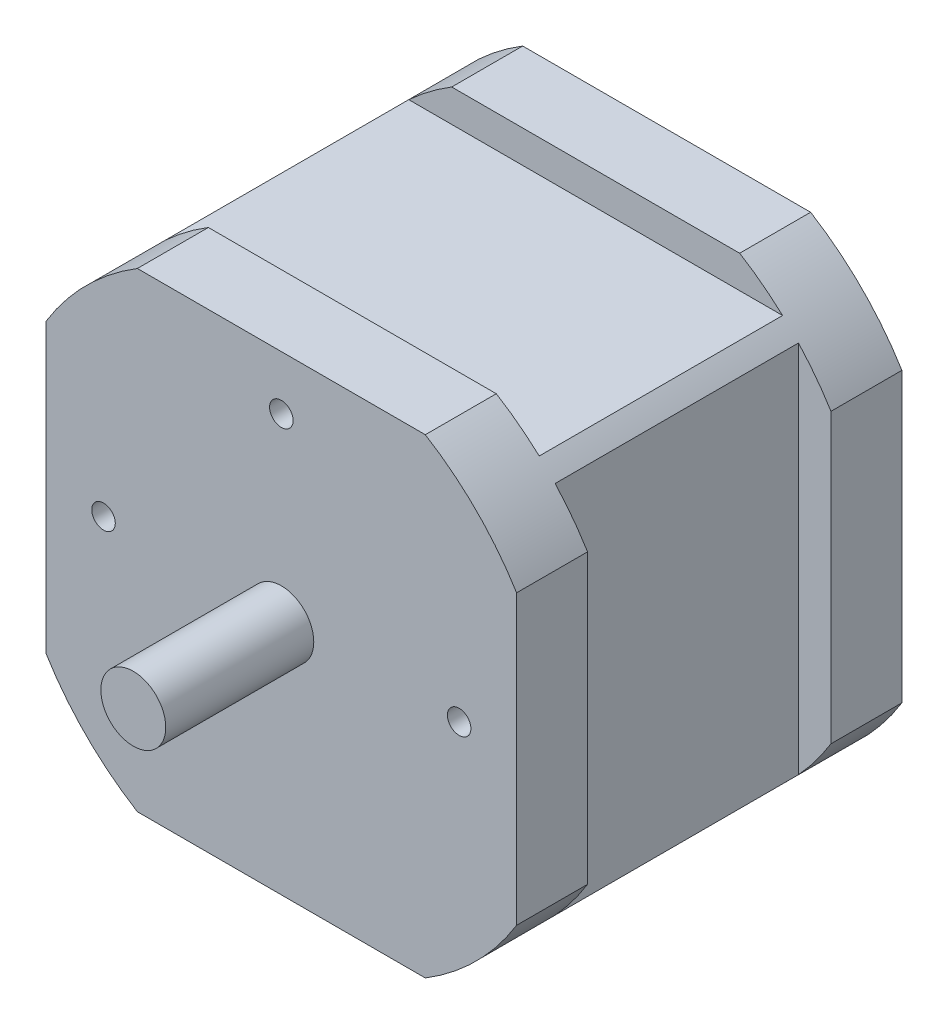
ISO-10303-21;
HEADER;
FILE_DESCRIPTION(('STEP AP214'),'2;1');
FILE_NAME('part.step','',(''),(''),'','','');
FILE_SCHEMA(('AUTOMOTIVE_DESIGN { 1 0 10303 214 1 1 1 1 }'));
ENDSEC;
DATA;
#1=APPLICATION_CONTEXT('core data for automotive mechanical design processes');
#2=APPLICATION_PROTOCOL_DEFINITION('international standard','automotive_design',2000,#1);
#3=PRODUCT_CONTEXT('',#1,'mechanical');
#4=PRODUCT('Part','Part','',(#3));
#5=PRODUCT_RELATED_PRODUCT_CATEGORY('part','',(#4));
#6=PRODUCT_DEFINITION_FORMATION('','',#4);
#7=PRODUCT_DEFINITION_CONTEXT('part definition',#1,'design');
#8=PRODUCT_DEFINITION('design','',#6,#7);
#9=PRODUCT_DEFINITION_SHAPE('','',#8);
#10=(LENGTH_UNIT() NAMED_UNIT(*) SI_UNIT(.MILLI.,.METRE.));
#11=(NAMED_UNIT(*) PLANE_ANGLE_UNIT() SI_UNIT($,.RADIAN.));
#12=(NAMED_UNIT(*) SI_UNIT($,.STERADIAN.) SOLID_ANGLE_UNIT());
#13=UNCERTAINTY_MEASURE_WITH_UNIT(LENGTH_MEASURE(1.E-05),#10,'distance_accuracy_value','');
#14=(GEOMETRIC_REPRESENTATION_CONTEXT(3) GLOBAL_UNCERTAINTY_ASSIGNED_CONTEXT((#13)) GLOBAL_UNIT_ASSIGNED_CONTEXT((#10,
#11,#12)) REPRESENTATION_CONTEXT('',''));
#15=CARTESIAN_POINT('',(0.,0.,0.));
#16=DIRECTION('',(0.,0.,1.));
#17=DIRECTION('',(1.,0.,0.));
#18=AXIS2_PLACEMENT_3D('',#15,#16,#17);
#19=CARTESIAN_POINT('',(25.,25.,30.));
#20=DIRECTION('',(-1.,0.,0.));
#21=DIRECTION('',(0.,-1.,0.));
#22=AXIS2_PLACEMENT_3D('',#19,#20,#21);
#23=PLANE('',#22);
#24=DIRECTION('',(0.,0.,1.));
#25=VECTOR('',#24,1.);
#26=CARTESIAN_POINT('',(25.,-23.0434372436058,-8.75));
#27=LINE('',#26,#25);
#28=CARTESIAN_POINT('',(25.,-23.0434372436058,0.));
#29=VERTEX_POINT('',#28);
#30=CARTESIAN_POINT('',(25.,-23.0434372436058,30.));
#31=VERTEX_POINT('',#30);
#32=EDGE_CURVE('E287',#29,#31,#27,.T.);
#33=ORIENTED_EDGE('',*,*,#32,.F.);
#34=DIRECTION('',(0.,1.,0.));
#35=VECTOR('',#34,1.);
#36=CARTESIAN_POINT('',(25.,25.,0.));
#37=LINE('',#36,#35);
#38=CARTESIAN_POINT('',(25.,23.0434372436058,0.));
#39=VERTEX_POINT('',#38);
#40=EDGE_CURVE('E362',#29,#39,#37,.T.);
#41=ORIENTED_EDGE('',*,*,#40,.T.);
#42=DIRECTION('',(0.,0.,1.));
#43=VECTOR('',#42,1.);
#44=CARTESIAN_POINT('',(25.,23.0434372436058,-8.75));
#45=LINE('',#44,#43);
#46=CARTESIAN_POINT('',(25.,23.0434372436058,30.));
#47=VERTEX_POINT('',#46);
#48=EDGE_CURVE('E294',#47,#39,#45,.F.);
#49=ORIENTED_EDGE('',*,*,#48,.F.);
#50=DIRECTION('',(0.,1.,0.));
#51=VECTOR('',#50,1.);
#52=CARTESIAN_POINT('',(25.,25.,30.));
#53=LINE('',#52,#51);
#54=EDGE_CURVE('E373',#31,#47,#53,.T.);
#55=ORIENTED_EDGE('',*,*,#54,.F.);
#56=EDGE_LOOP('',(#33,#41,#49,#55));
#57=FACE_BOUND('',#56,.T.);
#58=ADVANCED_FACE('F60',(#57),#23,.F.);
#59=CARTESIAN_POINT('',(-25.,25.,30.));
#60=DIRECTION('',(0.,-1.,0.));
#61=DIRECTION('',(0.,0.,-1.));
#62=AXIS2_PLACEMENT_3D('',#59,#60,#61);
#63=PLANE('',#62);
#64=DIRECTION('',(0.,0.,1.));
#65=VECTOR('',#64,1.);
#66=CARTESIAN_POINT('',(23.0434372436058,25.,-8.75));
#67=LINE('',#66,#65);
#68=CARTESIAN_POINT('',(23.0434372436058,25.,0.));
#69=VERTEX_POINT('',#68);
#70=CARTESIAN_POINT('',(23.0434372436058,25.,30.));
#71=VERTEX_POINT('',#70);
#72=EDGE_CURVE('E301',#69,#71,#67,.T.);
#73=ORIENTED_EDGE('',*,*,#72,.F.);
#74=DIRECTION('',(-1.,0.,0.));
#75=VECTOR('',#74,1.);
#76=CARTESIAN_POINT('',(-25.,25.,0.));
#77=LINE('',#76,#75);
#78=CARTESIAN_POINT('',(-23.0434372436058,25.,0.));
#79=VERTEX_POINT('',#78);
#80=EDGE_CURVE('E388',#69,#79,#77,.T.);
#81=ORIENTED_EDGE('',*,*,#80,.T.);
#82=DIRECTION('',(0.,0.,1.));
#83=VECTOR('',#82,1.);
#84=CARTESIAN_POINT('',(-23.0434372436058,25.,-8.75));
#85=LINE('',#84,#83);
#86=CARTESIAN_POINT('',(-23.0434372436058,25.,30.));
#87=VERTEX_POINT('',#86);
#88=EDGE_CURVE('E75',#87,#79,#85,.F.);
#89=ORIENTED_EDGE('',*,*,#88,.F.);
#90=DIRECTION('',(-1.,0.,0.));
#91=VECTOR('',#90,1.);
#92=CARTESIAN_POINT('',(-25.,25.,30.));
#93=LINE('',#92,#91);
#94=EDGE_CURVE('E376',#71,#87,#93,.T.);
#95=ORIENTED_EDGE('',*,*,#94,.F.);
#96=EDGE_LOOP('',(#73,#81,#89,#95));
#97=FACE_BOUND('',#96,.T.);
#98=ADVANCED_FACE('F470',(#97),#63,.F.);
#99=CARTESIAN_POINT('',(-25.,25.,30.));
#100=DIRECTION('',(1.,0.,0.));
#101=DIRECTION('',(0.,1.,0.));
#102=AXIS2_PLACEMENT_3D('',#99,#100,#101);
#103=PLANE('',#102);
#104=DIRECTION('',(0.,0.,1.));
#105=VECTOR('',#104,1.);
#106=CARTESIAN_POINT('',(-25.,23.0434372436058,-8.75));
#107=LINE('',#106,#105);
#108=CARTESIAN_POINT('',(-25.,23.0434372436058,0.));
#109=VERTEX_POINT('',#108);
#110=CARTESIAN_POINT('',(-25.,23.0434372436058,30.));
#111=VERTEX_POINT('',#110);
#112=EDGE_CURVE('E314',#109,#111,#107,.T.);
#113=ORIENTED_EDGE('',*,*,#112,.F.);
#114=DIRECTION('',(0.,-1.,0.));
#115=VECTOR('',#114,1.);
#116=CARTESIAN_POINT('',(-25.,25.,0.));
#117=LINE('',#116,#115);
#118=CARTESIAN_POINT('',(-25.,-23.0434372436058,0.));
#119=VERTEX_POINT('',#118);
#120=EDGE_CURVE('E391',#109,#119,#117,.T.);
#121=ORIENTED_EDGE('',*,*,#120,.T.);
#122=DIRECTION('',(0.,0.,1.));
#123=VECTOR('',#122,1.);
#124=CARTESIAN_POINT('',(-25.,-23.0434372436058,-8.75));
#125=LINE('',#124,#123);
#126=CARTESIAN_POINT('',(-25.,-23.0434372436058,30.));
#127=VERTEX_POINT('',#126);
#128=EDGE_CURVE('E83',#127,#119,#125,.F.);
#129=ORIENTED_EDGE('',*,*,#128,.F.);
#130=DIRECTION('',(0.,-1.,0.));
#131=VECTOR('',#130,1.);
#132=CARTESIAN_POINT('',(-25.,25.,30.));
#133=LINE('',#132,#131);
#134=EDGE_CURVE('E380',#111,#127,#133,.T.);
#135=ORIENTED_EDGE('',*,*,#134,.F.);
#136=EDGE_LOOP('',(#113,#121,#129,#135));
#137=FACE_BOUND('',#136,.T.);
#138=ADVANCED_FACE('F428',(#137),#103,.F.);
#139=CARTESIAN_POINT('',(-25.,-25.,30.));
#140=DIRECTION('',(0.,1.,0.));
#141=DIRECTION('',(0.,0.,1.));
#142=AXIS2_PLACEMENT_3D('',#139,#140,#141);
#143=PLANE('',#142);
#144=DIRECTION('',(0.,0.,1.));
#145=VECTOR('',#144,1.);
#146=CARTESIAN_POINT('',(-23.0434372436058,-25.,-8.75));
#147=LINE('',#146,#145);
#148=CARTESIAN_POINT('',(-23.0434372436058,-25.,0.));
#149=VERTEX_POINT('',#148);
#150=CARTESIAN_POINT('',(-23.0434372436058,-25.,30.));
#151=VERTEX_POINT('',#150);
#152=EDGE_CURVE('E274',#149,#151,#147,.T.);
#153=ORIENTED_EDGE('',*,*,#152,.F.);
#154=DIRECTION('',(1.,0.,0.));
#155=VECTOR('',#154,1.);
#156=CARTESIAN_POINT('',(-25.,-25.,0.));
#157=LINE('',#156,#155);
#158=CARTESIAN_POINT('',(23.0434372436058,-25.,0.));
#159=VERTEX_POINT('',#158);
#160=EDGE_CURVE('E377',#149,#159,#157,.T.);
#161=ORIENTED_EDGE('',*,*,#160,.T.);
#162=DIRECTION('',(0.,0.,1.));
#163=VECTOR('',#162,1.);
#164=CARTESIAN_POINT('',(23.0434372436058,-25.,-8.75));
#165=LINE('',#164,#163);
#166=CARTESIAN_POINT('',(23.0434372436058,-25.,30.));
#167=VERTEX_POINT('',#166);
#168=EDGE_CURVE('E280',#167,#159,#165,.F.);
#169=ORIENTED_EDGE('',*,*,#168,.F.);
#170=DIRECTION('',(1.,0.,0.));
#171=VECTOR('',#170,1.);
#172=CARTESIAN_POINT('',(-25.,-25.,30.));
#173=LINE('',#172,#171);
#174=EDGE_CURVE('E383',#151,#167,#173,.T.);
#175=ORIENTED_EDGE('',*,*,#174,.F.);
#176=EDGE_LOOP('',(#153,#161,#169,#175));
#177=FACE_BOUND('',#176,.T.);
#178=ADVANCED_FACE('F398',(#177),#143,.F.);
#179=CARTESIAN_POINT('',(0.,0.,30.));
#180=DIRECTION('',(0.,0.,1.));
#181=DIRECTION('',(1.,0.,0.));
#182=AXIS2_PLACEMENT_3D('',#179,#180,#181);
#183=PLANE('',#182);
#184=CARTESIAN_POINT('',(0.,0.,30.));
#185=DIRECTION('',(0.,0.,1.));
#186=DIRECTION('',(1.,0.,0.));
#187=AXIS2_PLACEMENT_3D('',#184,#185,#186);
#188=CIRCLE('',#187,34.);
#189=CARTESIAN_POINT('',(29.,17.7482393492988,30.));
#190=VERTEX_POINT('',#189);
#191=EDGE_CURVE('E296',#190,#47,#188,.T.);
#192=ORIENTED_EDGE('',*,*,#191,.F.);
#193=DIRECTION('',(0.,1.,0.));
#194=VECTOR('',#193,1.);
#195=CARTESIAN_POINT('',(29.,29.,30.));
#196=LINE('',#195,#194);
#197=CARTESIAN_POINT('',(29.,-17.7482393492988,30.));
#198=VERTEX_POINT('',#197);
#199=EDGE_CURVE('E338',#198,#190,#196,.T.);
#200=ORIENTED_EDGE('',*,*,#199,.F.);
#201=EDGE_CURVE('E289',#31,#198,#188,.T.);
#202=ORIENTED_EDGE('',*,*,#201,.F.);
#203=ORIENTED_EDGE('',*,*,#54,.T.);
#204=EDGE_LOOP('',(#192,#200,#202,#203));
#205=FACE_BOUND('',#204,.T.);
#206=ADVANCED_FACE('F456',(#205),#183,.F.);
#207=CARTESIAN_POINT('',(17.7482393492988,29.,30.));
#208=VERTEX_POINT('',#207);
#209=EDGE_CURVE('E303',#71,#208,#188,.T.);
#210=ORIENTED_EDGE('',*,*,#209,.F.);
#211=ORIENTED_EDGE('',*,*,#94,.T.);
#212=CARTESIAN_POINT('',(-17.7482393492988,29.,30.));
#213=VERTEX_POINT('',#212);
#214=EDGE_CURVE('E309',#213,#87,#188,.T.);
#215=ORIENTED_EDGE('',*,*,#214,.F.);
#216=DIRECTION('',(-1.,0.,0.));
#217=VECTOR('',#216,1.);
#218=CARTESIAN_POINT('',(-29.,29.,30.));
#219=LINE('',#218,#217);
#220=EDGE_CURVE('E365',#208,#213,#219,.T.);
#221=ORIENTED_EDGE('',*,*,#220,.F.);
#222=EDGE_LOOP('',(#210,#211,#215,#221));
#223=FACE_BOUND('',#222,.T.);
#224=ADVANCED_FACE('F464',(#223),#183,.F.);
#225=CARTESIAN_POINT('',(-29.,17.7482393492989,30.));
#226=VERTEX_POINT('',#225);
#227=EDGE_CURVE('E269',#111,#226,#188,.T.);
#228=ORIENTED_EDGE('',*,*,#227,.F.);
#229=ORIENTED_EDGE('',*,*,#134,.T.);
#230=CARTESIAN_POINT('',(-29.,-17.7482393492989,30.));
#231=VERTEX_POINT('',#230);
#232=EDGE_CURVE('E266',#231,#127,#188,.T.);
#233=ORIENTED_EDGE('',*,*,#232,.F.);
#234=DIRECTION('',(0.,-1.,0.));
#235=VECTOR('',#234,1.);
#236=CARTESIAN_POINT('',(-29.,29.,30.));
#237=LINE('',#236,#235);
#238=EDGE_CURVE('E368',#226,#231,#237,.T.);
#239=ORIENTED_EDGE('',*,*,#238,.F.);
#240=EDGE_LOOP('',(#228,#229,#233,#239));
#241=FACE_BOUND('',#240,.T.);
#242=ADVANCED_FACE('F431',(#241),#183,.F.);
#243=CARTESIAN_POINT('',(-17.7482393492989,-29.,30.));
#244=VERTEX_POINT('',#243);
#245=EDGE_CURVE('E270',#151,#244,#188,.T.);
#246=ORIENTED_EDGE('',*,*,#245,.F.);
#247=ORIENTED_EDGE('',*,*,#174,.T.);
#248=CARTESIAN_POINT('',(17.7482393492989,-29.,30.));
#249=VERTEX_POINT('',#248);
#250=EDGE_CURVE('E282',#249,#167,#188,.T.);
#251=ORIENTED_EDGE('',*,*,#250,.F.);
#252=DIRECTION('',(1.,0.,0.));
#253=VECTOR('',#252,1.);
#254=CARTESIAN_POINT('',(-29.,-29.,30.));
#255=LINE('',#254,#253);
#256=EDGE_CURVE('E353',#244,#249,#255,.T.);
#257=ORIENTED_EDGE('',*,*,#256,.F.);
#258=EDGE_LOOP('',(#246,#247,#251,#257));
#259=FACE_BOUND('',#258,.T.);
#260=ADVANCED_FACE('F452',(#259),#183,.F.);
#261=CARTESIAN_POINT('',(29.,29.,38.75));
#262=DIRECTION('',(-1.,0.,0.));
#263=DIRECTION('',(0.,-1.,0.));
#264=AXIS2_PLACEMENT_3D('',#261,#262,#263);
#265=PLANE('',#264);
#266=DIRECTION('',(0.,0.,1.));
#267=VECTOR('',#266,1.);
#268=CARTESIAN_POINT('',(29.,-17.7482393492988,-8.75));
#269=LINE('',#268,#267);
#270=CARTESIAN_POINT('',(29.,-17.7482393492988,38.75));
#271=VERTEX_POINT('',#270);
#272=EDGE_CURVE('E290',#198,#271,#269,.T.);
#273=ORIENTED_EDGE('',*,*,#272,.F.);
#274=ORIENTED_EDGE('',*,*,#199,.T.);
#275=DIRECTION('',(0.,0.,1.));
#276=VECTOR('',#275,1.);
#277=CARTESIAN_POINT('',(29.,17.7482393492988,-8.75));
#278=LINE('',#277,#276);
#279=CARTESIAN_POINT('',(29.,17.7482393492988,38.75));
#280=VERTEX_POINT('',#279);
#281=EDGE_CURVE('E297',#280,#190,#278,.F.);
#282=ORIENTED_EDGE('',*,*,#281,.F.);
#283=DIRECTION('',(0.,1.,0.));
#284=VECTOR('',#283,1.);
#285=CARTESIAN_POINT('',(29.,29.,38.75));
#286=LINE('',#285,#284);
#287=EDGE_CURVE('E349',#271,#280,#286,.T.);
#288=ORIENTED_EDGE('',*,*,#287,.F.);
#289=EDGE_LOOP('',(#273,#274,#282,#288));
#290=FACE_BOUND('',#289,.T.);
#291=ADVANCED_FACE('F454',(#290),#265,.F.);
#292=CARTESIAN_POINT('',(-29.,29.,38.75));
#293=DIRECTION('',(0.,-1.,0.));
#294=DIRECTION('',(0.,0.,-1.));
#295=AXIS2_PLACEMENT_3D('',#292,#293,#294);
#296=PLANE('',#295);
#297=DIRECTION('',(0.,0.,1.));
#298=VECTOR('',#297,1.);
#299=CARTESIAN_POINT('',(17.7482393492988,29.,-8.75));
#300=LINE('',#299,#298);
#301=CARTESIAN_POINT('',(17.7482393492988,29.,38.75));
#302=VERTEX_POINT('',#301);
#303=EDGE_CURVE('E304',#208,#302,#300,.T.);
#304=ORIENTED_EDGE('',*,*,#303,.F.);
#305=ORIENTED_EDGE('',*,*,#220,.T.);
#306=DIRECTION('',(0.,0.,1.));
#307=VECTOR('',#306,1.);
#308=CARTESIAN_POINT('',(-17.7482393492988,29.,-8.75));
#309=LINE('',#308,#307);
#310=CARTESIAN_POINT('',(-17.7482393492988,29.,38.75));
#311=VERTEX_POINT('',#310);
#312=EDGE_CURVE('E310',#311,#213,#309,.F.);
#313=ORIENTED_EDGE('',*,*,#312,.F.);
#314=DIRECTION('',(-1.,0.,0.));
#315=VECTOR('',#314,1.);
#316=CARTESIAN_POINT('',(-29.,29.,38.75));
#317=LINE('',#316,#315);
#318=EDGE_CURVE('E352',#302,#311,#317,.T.);
#319=ORIENTED_EDGE('',*,*,#318,.F.);
#320=EDGE_LOOP('',(#304,#305,#313,#319));
#321=FACE_BOUND('',#320,.T.);
#322=ADVANCED_FACE('F461',(#321),#296,.F.);
#323=CARTESIAN_POINT('',(-29.,29.,38.75));
#324=DIRECTION('',(1.,0.,0.));
#325=DIRECTION('',(0.,1.,0.));
#326=AXIS2_PLACEMENT_3D('',#323,#324,#325);
#327=PLANE('',#326);
#328=DIRECTION('',(0.,0.,1.));
#329=VECTOR('',#328,1.);
#330=CARTESIAN_POINT('',(-29.,17.7482393492989,-8.75));
#331=LINE('',#330,#329);
#332=CARTESIAN_POINT('',(-29.,17.7482393492989,38.75));
#333=VERTEX_POINT('',#332);
#334=EDGE_CURVE('E316',#226,#333,#331,.T.);
#335=ORIENTED_EDGE('',*,*,#334,.F.);
#336=ORIENTED_EDGE('',*,*,#238,.T.);
#337=DIRECTION('',(0.,0.,1.));
#338=VECTOR('',#337,1.);
#339=CARTESIAN_POINT('',(-29.,-17.7482393492989,-8.75));
#340=LINE('',#339,#338);
#341=CARTESIAN_POINT('',(-29.,-17.7482393492989,38.75));
#342=VERTEX_POINT('',#341);
#343=EDGE_CURVE('E268',#342,#231,#340,.F.);
#344=ORIENTED_EDGE('',*,*,#343,.F.);
#345=DIRECTION('',(0.,-1.,0.));
#346=VECTOR('',#345,1.);
#347=CARTESIAN_POINT('',(-29.,29.,38.75));
#348=LINE('',#347,#346);
#349=EDGE_CURVE('E356',#333,#342,#348,.T.);
#350=ORIENTED_EDGE('',*,*,#349,.F.);
#351=EDGE_LOOP('',(#335,#336,#344,#350));
#352=FACE_BOUND('',#351,.T.);
#353=ADVANCED_FACE('F517',(#352),#327,.F.);
#354=CARTESIAN_POINT('',(-29.,-29.,38.75));
#355=DIRECTION('',(0.,1.,0.));
#356=DIRECTION('',(0.,0.,1.));
#357=AXIS2_PLACEMENT_3D('',#354,#355,#356);
#358=PLANE('',#357);
#359=DIRECTION('',(0.,0.,1.));
#360=VECTOR('',#359,1.);
#361=CARTESIAN_POINT('',(-17.7482393492989,-29.,-8.75));
#362=LINE('',#361,#360);
#363=CARTESIAN_POINT('',(-17.7482393492989,-29.,38.75));
#364=VERTEX_POINT('',#363);
#365=EDGE_CURVE('E276',#244,#364,#362,.T.);
#366=ORIENTED_EDGE('',*,*,#365,.F.);
#367=ORIENTED_EDGE('',*,*,#256,.T.);
#368=DIRECTION('',(0.,0.,1.));
#369=VECTOR('',#368,1.);
#370=CARTESIAN_POINT('',(17.7482393492989,-29.,-8.75));
#371=LINE('',#370,#369);
#372=CARTESIAN_POINT('',(17.7482393492989,-29.,38.75));
#373=VERTEX_POINT('',#372);
#374=EDGE_CURVE('E283',#373,#249,#371,.F.);
#375=ORIENTED_EDGE('',*,*,#374,.F.);
#376=DIRECTION('',(1.,0.,0.));
#377=VECTOR('',#376,1.);
#378=CARTESIAN_POINT('',(-29.,-29.,38.75));
#379=LINE('',#378,#377);
#380=EDGE_CURVE('E359',#364,#373,#379,.T.);
#381=ORIENTED_EDGE('',*,*,#380,.F.);
#382=EDGE_LOOP('',(#366,#367,#375,#381));
#383=FACE_BOUND('',#382,.T.);
#384=ADVANCED_FACE('F450',(#383),#358,.F.);
#385=CARTESIAN_POINT('',(0.,0.,38.75));
#386=DIRECTION('',(0.,0.,1.));
#387=DIRECTION('',(1.,0.,0.));
#388=AXIS2_PLACEMENT_3D('',#385,#386,#387);
#389=PLANE('',#388);
#390=CARTESIAN_POINT('',(0.,22.35,38.75));
#391=DIRECTION('',(0.,0.,1.));
#392=DIRECTION('',(1.,0.,0.));
#393=AXIS2_PLACEMENT_3D('',#390,#391,#392);
#394=CIRCLE('',#393,1.45);
#395=CARTESIAN_POINT('',(1.45,22.35,38.75));
#396=VERTEX_POINT('',#395);
#397=EDGE_CURVE('E238',#396,#396,#394,.T.);
#398=ORIENTED_EDGE('',*,*,#397,.F.);
#399=EDGE_LOOP('',(#398));
#400=FACE_BOUND('',#399,.T.);
#401=CARTESIAN_POINT('',(-21.92,0.43,38.75));
#402=DIRECTION('',(0.,0.,1.));
#403=DIRECTION('',(1.,0.,0.));
#404=AXIS2_PLACEMENT_3D('',#401,#402,#403);
#405=CIRCLE('',#404,1.45);
#406=CARTESIAN_POINT('',(-20.47,0.43,38.75));
#407=VERTEX_POINT('',#406);
#408=EDGE_CURVE('E237',#407,#407,#405,.T.);
#409=ORIENTED_EDGE('',*,*,#408,.F.);
#410=EDGE_LOOP('',(#409));
#411=FACE_BOUND('',#410,.T.);
#412=CARTESIAN_POINT('',(21.92,0.430000000000008,38.75));
#413=DIRECTION('',(0.,0.,1.));
#414=DIRECTION('',(1.,0.,0.));
#415=AXIS2_PLACEMENT_3D('',#412,#413,#414);
#416=CIRCLE('',#415,1.45);
#417=CARTESIAN_POINT('',(23.37,0.430000000000008,38.75));
#418=VERTEX_POINT('',#417);
#419=EDGE_CURVE('E248',#418,#418,#416,.T.);
#420=ORIENTED_EDGE('',*,*,#419,.F.);
#421=EDGE_LOOP('',(#420));
#422=FACE_BOUND('',#421,.T.);
#423=CARTESIAN_POINT('',(0.,0.,38.75));
#424=DIRECTION('',(0.,0.,1.));
#425=DIRECTION('',(1.,0.,0.));
#426=AXIS2_PLACEMENT_3D('',#423,#424,#425);
#427=CIRCLE('',#426,4.);
#428=CARTESIAN_POINT('',(4.,0.,38.75));
#429=VERTEX_POINT('',#428);
#430=EDGE_CURVE('E318',#429,#429,#427,.T.);
#431=ORIENTED_EDGE('',*,*,#430,.F.);
#432=EDGE_LOOP('',(#431));
#433=FACE_BOUND('',#432,.T.);
#434=ORIENTED_EDGE('',*,*,#287,.T.);
#435=CARTESIAN_POINT('',(0.,0.,38.75));
#436=DIRECTION('',(0.,0.,1.));
#437=DIRECTION('',(1.,0.,0.));
#438=AXIS2_PLACEMENT_3D('',#435,#436,#437);
#439=CIRCLE('',#438,34.);
#440=EDGE_CURVE('E260',#280,#302,#439,.T.);
#441=ORIENTED_EDGE('',*,*,#440,.T.);
#442=ORIENTED_EDGE('',*,*,#318,.T.);
#443=EDGE_CURVE('E263',#311,#333,#439,.T.);
#444=ORIENTED_EDGE('',*,*,#443,.T.);
#445=ORIENTED_EDGE('',*,*,#349,.T.);
#446=EDGE_CURVE('E513',#342,#364,#439,.T.);
#447=ORIENTED_EDGE('',*,*,#446,.T.);
#448=ORIENTED_EDGE('',*,*,#380,.T.);
#449=EDGE_CURVE('E254',#373,#271,#439,.T.);
#450=ORIENTED_EDGE('',*,*,#449,.T.);
#451=EDGE_LOOP('',(#434,#441,#442,#444,#445,#447,#448,#450));
#452=FACE_BOUND('',#451,.T.);
#453=ADVANCED_FACE('F507',(#400,#411,#422,#433,#452),#389,.T.);
#454=CARTESIAN_POINT('',(-29.,29.,-8.75));
#455=DIRECTION('',(1.,0.,0.));
#456=DIRECTION('',(0.,0.,-1.));
#457=AXIS2_PLACEMENT_3D('',#454,#455,#456);
#458=PLANE('',#457);
#459=DIRECTION('',(0.,0.,1.));
#460=VECTOR('',#459,1.);
#461=CARTESIAN_POINT('',(-29.,17.7482393492989,-8.75));
#462=LINE('',#461,#460);
#463=CARTESIAN_POINT('',(-29.,17.7482393492989,-8.75));
#464=VERTEX_POINT('',#463);
#465=CARTESIAN_POINT('',(-29.,17.7482393492989,0.));
#466=VERTEX_POINT('',#465);
#467=EDGE_CURVE('E312',#464,#466,#462,.T.);
#468=ORIENTED_EDGE('',*,*,#467,.F.);
#469=DIRECTION('',(0.,1.,0.));
#470=VECTOR('',#469,1.);
#471=CARTESIAN_POINT('',(-29.,29.,-8.75));
#472=LINE('',#471,#470);
#473=CARTESIAN_POINT('',(-29.,-17.7482393492989,-8.75));
#474=VERTEX_POINT('',#473);
#475=EDGE_CURVE('E325',#474,#464,#472,.T.);
#476=ORIENTED_EDGE('',*,*,#475,.F.);
#477=DIRECTION('',(0.,0.,1.));
#478=VECTOR('',#477,1.);
#479=CARTESIAN_POINT('',(-29.,-17.7482393492989,-8.75));
#480=LINE('',#479,#478);
#481=CARTESIAN_POINT('',(-29.,-17.7482393492989,0.));
#482=VERTEX_POINT('',#481);
#483=EDGE_CURVE('E257',#482,#474,#480,.F.);
#484=ORIENTED_EDGE('',*,*,#483,.F.);
#485=DIRECTION('',(0.,1.,0.));
#486=VECTOR('',#485,1.);
#487=CARTESIAN_POINT('',(-29.,29.,0.));
#488=LINE('',#487,#486);
#489=EDGE_CURVE('E322',#482,#466,#488,.T.);
#490=ORIENTED_EDGE('',*,*,#489,.T.);
#491=EDGE_LOOP('',(#468,#476,#484,#490));
#492=FACE_BOUND('',#491,.T.);
#493=ADVANCED_FACE('F420',(#492),#458,.F.);
#494=CARTESIAN_POINT('',(29.,29.,-8.75));
#495=DIRECTION('',(0.,-1.,0.));
#496=DIRECTION('',(0.,0.,-1.));
#497=AXIS2_PLACEMENT_3D('',#494,#495,#496);
#498=PLANE('',#497);
#499=DIRECTION('',(0.,0.,1.));
#500=VECTOR('',#499,1.);
#501=CARTESIAN_POINT('',(17.7482393492989,29.,-8.75));
#502=LINE('',#501,#500);
#503=CARTESIAN_POINT('',(17.7482393492989,29.,-8.75));
#504=VERTEX_POINT('',#503);
#505=CARTESIAN_POINT('',(17.7482393492989,29.,0.));
#506=VERTEX_POINT('',#505);
#507=EDGE_CURVE('E299',#504,#506,#502,.T.);
#508=ORIENTED_EDGE('',*,*,#507,.F.);
#509=DIRECTION('',(1.,0.,0.));
#510=VECTOR('',#509,1.);
#511=CARTESIAN_POINT('',(29.,29.,-8.75));
#512=LINE('',#511,#510);
#513=CARTESIAN_POINT('',(-17.7482393492989,29.,-8.75));
#514=VERTEX_POINT('',#513);
#515=EDGE_CURVE('E328',#514,#504,#512,.T.);
#516=ORIENTED_EDGE('',*,*,#515,.F.);
#517=DIRECTION('',(0.,0.,1.));
#518=VECTOR('',#517,1.);
#519=CARTESIAN_POINT('',(-17.7482393492989,29.,-8.75));
#520=LINE('',#519,#518);
#521=CARTESIAN_POINT('',(-17.7482393492989,29.,0.));
#522=VERTEX_POINT('',#521);
#523=EDGE_CURVE('E306',#522,#514,#520,.F.);
#524=ORIENTED_EDGE('',*,*,#523,.F.);
#525=DIRECTION('',(1.,0.,0.));
#526=VECTOR('',#525,1.);
#527=CARTESIAN_POINT('',(29.,29.,0.));
#528=LINE('',#527,#526);
#529=EDGE_CURVE('E341',#522,#506,#528,.T.);
#530=ORIENTED_EDGE('',*,*,#529,.T.);
#531=EDGE_LOOP('',(#508,#516,#524,#530));
#532=FACE_BOUND('',#531,.T.);
#533=ADVANCED_FACE('F496',(#532),#498,.F.);
#534=CARTESIAN_POINT('',(29.,29.,-8.75));
#535=DIRECTION('',(-1.,0.,0.));
#536=DIRECTION('',(0.,0.,1.));
#537=AXIS2_PLACEMENT_3D('',#534,#535,#536);
#538=PLANE('',#537);
#539=DIRECTION('',(0.,0.,1.));
#540=VECTOR('',#539,1.);
#541=CARTESIAN_POINT('',(29.,-17.7482393492989,-8.75));
#542=LINE('',#541,#540);
#543=CARTESIAN_POINT('',(29.,-17.7482393492989,-8.75));
#544=VERTEX_POINT('',#543);
#545=CARTESIAN_POINT('',(29.,-17.7482393492989,0.));
#546=VERTEX_POINT('',#545);
#547=EDGE_CURVE('E285',#544,#546,#542,.T.);
#548=ORIENTED_EDGE('',*,*,#547,.F.);
#549=DIRECTION('',(0.,-1.,0.));
#550=VECTOR('',#549,1.);
#551=CARTESIAN_POINT('',(29.,29.,-8.75));
#552=LINE('',#551,#550);
#553=CARTESIAN_POINT('',(29.,17.7482393492989,-8.75));
#554=VERTEX_POINT('',#553);
#555=EDGE_CURVE('E332',#554,#544,#552,.T.);
#556=ORIENTED_EDGE('',*,*,#555,.F.);
#557=DIRECTION('',(0.,0.,1.));
#558=VECTOR('',#557,1.);
#559=CARTESIAN_POINT('',(29.,17.7482393492989,-8.75));
#560=LINE('',#559,#558);
#561=CARTESIAN_POINT('',(29.,17.7482393492989,0.));
#562=VERTEX_POINT('',#561);
#563=EDGE_CURVE('E292',#562,#554,#560,.F.);
#564=ORIENTED_EDGE('',*,*,#563,.F.);
#565=DIRECTION('',(0.,-1.,0.));
#566=VECTOR('',#565,1.);
#567=CARTESIAN_POINT('',(29.,29.,0.));
#568=LINE('',#567,#566);
#569=EDGE_CURVE('E344',#562,#546,#568,.T.);
#570=ORIENTED_EDGE('',*,*,#569,.T.);
#571=EDGE_LOOP('',(#548,#556,#564,#570));
#572=FACE_BOUND('',#571,.T.);
#573=ADVANCED_FACE('F595',(#572),#538,.F.);
#574=CARTESIAN_POINT('',(29.,-29.,-8.75));
#575=DIRECTION('',(0.,1.,0.));
#576=DIRECTION('',(0.,0.,1.));
#577=AXIS2_PLACEMENT_3D('',#574,#575,#576);
#578=PLANE('',#577);
#579=DIRECTION('',(0.,0.,1.));
#580=VECTOR('',#579,1.);
#581=CARTESIAN_POINT('',(-17.7482393492989,-29.,-8.75));
#582=LINE('',#581,#580);
#583=CARTESIAN_POINT('',(-17.7482393492989,-29.,-8.75));
#584=VERTEX_POINT('',#583);
#585=CARTESIAN_POINT('',(-17.7482393492989,-29.,0.));
#586=VERTEX_POINT('',#585);
#587=EDGE_CURVE('E272',#584,#586,#582,.T.);
#588=ORIENTED_EDGE('',*,*,#587,.F.);
#589=DIRECTION('',(-1.,0.,0.));
#590=VECTOR('',#589,1.);
#591=CARTESIAN_POINT('',(29.,-29.,-8.75));
#592=LINE('',#591,#590);
#593=CARTESIAN_POINT('',(17.7482393492989,-29.,-8.75));
#594=VERTEX_POINT('',#593);
#595=EDGE_CURVE('E335',#594,#584,#592,.T.);
#596=ORIENTED_EDGE('',*,*,#595,.F.);
#597=DIRECTION('',(0.,0.,1.));
#598=VECTOR('',#597,1.);
#599=CARTESIAN_POINT('',(17.7482393492989,-29.,-8.75));
#600=LINE('',#599,#598);
#601=CARTESIAN_POINT('',(17.7482393492989,-29.,0.));
#602=VERTEX_POINT('',#601);
#603=EDGE_CURVE('E278',#602,#594,#600,.F.);
#604=ORIENTED_EDGE('',*,*,#603,.F.);
#605=DIRECTION('',(-1.,0.,0.));
#606=VECTOR('',#605,1.);
#607=CARTESIAN_POINT('',(29.,-29.,0.));
#608=LINE('',#607,#606);
#609=EDGE_CURVE('E329',#602,#586,#608,.T.);
#610=ORIENTED_EDGE('',*,*,#609,.T.);
#611=EDGE_LOOP('',(#588,#596,#604,#610));
#612=FACE_BOUND('',#611,.T.);
#613=ADVANCED_FACE('F604',(#612),#578,.F.);
#614=CARTESIAN_POINT('',(0.,0.,-8.75));
#615=DIRECTION('',(0.,0.,-1.));
#616=DIRECTION('',(-1.,0.,0.));
#617=AXIS2_PLACEMENT_3D('',#614,#615,#616);
#618=PLANE('',#617);
#619=ORIENTED_EDGE('',*,*,#475,.T.);
#620=CARTESIAN_POINT('',(0.,0.,-8.75));
#621=DIRECTION('',(0.,0.,1.));
#622=DIRECTION('',(1.,0.,0.));
#623=AXIS2_PLACEMENT_3D('',#620,#621,#622);
#624=CIRCLE('',#623,34.);
#625=EDGE_CURVE('E258',#514,#464,#624,.T.);
#626=ORIENTED_EDGE('',*,*,#625,.F.);
#627=ORIENTED_EDGE('',*,*,#515,.T.);
#628=EDGE_CURVE('E255',#554,#504,#624,.T.);
#629=ORIENTED_EDGE('',*,*,#628,.F.);
#630=ORIENTED_EDGE('',*,*,#555,.T.);
#631=EDGE_CURVE('E259',#594,#544,#624,.T.);
#632=ORIENTED_EDGE('',*,*,#631,.F.);
#633=ORIENTED_EDGE('',*,*,#595,.T.);
#634=EDGE_CURVE('E833',#474,#584,#624,.T.);
#635=ORIENTED_EDGE('',*,*,#634,.F.);
#636=EDGE_LOOP('',(#619,#626,#627,#629,#630,#632,#633,#635));
#637=FACE_BOUND('',#636,.T.);
#638=ADVANCED_FACE('F614',(#637),#618,.T.);
#639=CARTESIAN_POINT('',(0.,0.,0.));
#640=DIRECTION('',(0.,0.,-1.));
#641=DIRECTION('',(-1.,0.,0.));
#642=AXIS2_PLACEMENT_3D('',#639,#640,#641);
#643=PLANE('',#642);
#644=CARTESIAN_POINT('',(0.,0.,0.));
#645=DIRECTION('',(0.,0.,-1.));
#646=DIRECTION('',(-1.,0.,0.));
#647=AXIS2_PLACEMENT_3D('',#644,#645,#646);
#648=CIRCLE('',#647,34.);
#649=EDGE_CURVE('E13',#466,#109,#648,.T.);
#650=ORIENTED_EDGE('',*,*,#649,.F.);
#651=ORIENTED_EDGE('',*,*,#489,.F.);
#652=EDGE_CURVE('E63',#119,#482,#648,.T.);
#653=ORIENTED_EDGE('',*,*,#652,.F.);
#654=ORIENTED_EDGE('',*,*,#120,.F.);
#655=EDGE_LOOP('',(#650,#651,#653,#654));
#656=FACE_BOUND('',#655,.T.);
#657=ADVANCED_FACE('F422',(#656),#643,.F.);
#658=EDGE_CURVE('E68',#79,#522,#648,.T.);
#659=ORIENTED_EDGE('',*,*,#658,.F.);
#660=ORIENTED_EDGE('',*,*,#80,.F.);
#661=EDGE_CURVE('E485',#506,#69,#648,.T.);
#662=ORIENTED_EDGE('',*,*,#661,.F.);
#663=ORIENTED_EDGE('',*,*,#529,.F.);
#664=EDGE_LOOP('',(#659,#660,#662,#663));
#665=FACE_BOUND('',#664,.T.);
#666=ADVANCED_FACE('F497',(#665),#643,.F.);
#667=EDGE_CURVE('E410',#39,#562,#648,.T.);
#668=ORIENTED_EDGE('',*,*,#667,.F.);
#669=ORIENTED_EDGE('',*,*,#40,.F.);
#670=EDGE_CURVE('E409',#546,#29,#648,.T.);
#671=ORIENTED_EDGE('',*,*,#670,.F.);
#672=ORIENTED_EDGE('',*,*,#569,.F.);
#673=EDGE_LOOP('',(#668,#669,#671,#672));
#674=FACE_BOUND('',#673,.T.);
#675=ADVANCED_FACE('F482',(#674),#643,.F.);
#676=EDGE_CURVE('E406',#159,#602,#648,.T.);
#677=ORIENTED_EDGE('',*,*,#676,.F.);
#678=ORIENTED_EDGE('',*,*,#160,.F.);
#679=EDGE_CURVE('E405',#586,#149,#648,.T.);
#680=ORIENTED_EDGE('',*,*,#679,.F.);
#681=ORIENTED_EDGE('',*,*,#609,.F.);
#682=EDGE_LOOP('',(#677,#678,#680,#681));
#683=FACE_BOUND('',#682,.T.);
#684=ADVANCED_FACE('F403',(#683),#643,.F.);
#685=CARTESIAN_POINT('',(0.,0.,57.));
#686=DIRECTION('',(0.,0.,-1.));
#687=DIRECTION('',(-1.,0.,0.));
#688=AXIS2_PLACEMENT_3D('',#685,#686,#687);
#689=CYLINDRICAL_SURFACE('',#688,4.);
#690=CARTESIAN_POINT('',(0.,0.,57.));
#691=DIRECTION('',(0.,0.,1.));
#692=DIRECTION('',(1.,0.,0.));
#693=AXIS2_PLACEMENT_3D('',#690,#691,#692);
#694=CIRCLE('',#693,4.);
#695=CARTESIAN_POINT('',(4.,0.,57.));
#696=VERTEX_POINT('',#695);
#697=EDGE_CURVE('E319',#696,#696,#694,.T.);
#698=ORIENTED_EDGE('',*,*,#697,.F.);
#699=EDGE_LOOP('',(#698));
#700=FACE_BOUND('',#699,.T.);
#701=ORIENTED_EDGE('',*,*,#430,.T.);
#702=EDGE_LOOP('',(#701));
#703=FACE_BOUND('',#702,.T.);
#704=ADVANCED_FACE('F655',(#700,#703),#689,.T.);
#705=CARTESIAN_POINT('',(0.,0.,57.));
#706=DIRECTION('',(0.,0.,1.));
#707=DIRECTION('',(1.,0.,0.));
#708=AXIS2_PLACEMENT_3D('',#705,#706,#707);
#709=PLANE('',#708);
#710=ORIENTED_EDGE('',*,*,#697,.T.);
#711=EDGE_LOOP('',(#710));
#712=FACE_BOUND('',#711,.T.);
#713=ADVANCED_FACE('F665',(#712),#709,.T.);
#714=CARTESIAN_POINT('',(0.,0.,-8.75));
#715=DIRECTION('',(0.,0.,1.));
#716=DIRECTION('',(1.,0.,0.));
#717=AXIS2_PLACEMENT_3D('',#714,#715,#716);
#718=CYLINDRICAL_SURFACE('',#717,34.);
#719=ORIENTED_EDGE('',*,*,#365,.T.);
#720=ORIENTED_EDGE('',*,*,#446,.F.);
#721=ORIENTED_EDGE('',*,*,#343,.T.);
#722=ORIENTED_EDGE('',*,*,#232,.T.);
#723=ORIENTED_EDGE('',*,*,#128,.T.);
#724=ORIENTED_EDGE('',*,*,#652,.T.);
#725=ORIENTED_EDGE('',*,*,#483,.T.);
#726=ORIENTED_EDGE('',*,*,#634,.T.);
#727=ORIENTED_EDGE('',*,*,#587,.T.);
#728=ORIENTED_EDGE('',*,*,#679,.T.);
#729=ORIENTED_EDGE('',*,*,#152,.T.);
#730=ORIENTED_EDGE('',*,*,#245,.T.);
#731=EDGE_LOOP('',(#719,#720,#721,#722,#723,#724,#725,#726,#727,#728,#729,#730));
#732=FACE_BOUND('',#731,.T.);
#733=ADVANCED_FACE('F412',(#732),#718,.T.);
#734=ORIENTED_EDGE('',*,*,#272,.T.);
#735=ORIENTED_EDGE('',*,*,#449,.F.);
#736=ORIENTED_EDGE('',*,*,#374,.T.);
#737=ORIENTED_EDGE('',*,*,#250,.T.);
#738=ORIENTED_EDGE('',*,*,#168,.T.);
#739=ORIENTED_EDGE('',*,*,#676,.T.);
#740=ORIENTED_EDGE('',*,*,#603,.T.);
#741=ORIENTED_EDGE('',*,*,#631,.T.);
#742=ORIENTED_EDGE('',*,*,#547,.T.);
#743=ORIENTED_EDGE('',*,*,#670,.T.);
#744=ORIENTED_EDGE('',*,*,#32,.T.);
#745=ORIENTED_EDGE('',*,*,#201,.T.);
#746=EDGE_LOOP('',(#734,#735,#736,#737,#738,#739,#740,#741,#742,#743,#744,#745));
#747=FACE_BOUND('',#746,.T.);
#748=ADVANCED_FACE('F512',(#747),#718,.T.);
#749=ORIENTED_EDGE('',*,*,#303,.T.);
#750=ORIENTED_EDGE('',*,*,#440,.F.);
#751=ORIENTED_EDGE('',*,*,#281,.T.);
#752=ORIENTED_EDGE('',*,*,#191,.T.);
#753=ORIENTED_EDGE('',*,*,#48,.T.);
#754=ORIENTED_EDGE('',*,*,#667,.T.);
#755=ORIENTED_EDGE('',*,*,#563,.T.);
#756=ORIENTED_EDGE('',*,*,#628,.T.);
#757=ORIENTED_EDGE('',*,*,#507,.T.);
#758=ORIENTED_EDGE('',*,*,#661,.T.);
#759=ORIENTED_EDGE('',*,*,#72,.T.);
#760=ORIENTED_EDGE('',*,*,#209,.T.);
#761=EDGE_LOOP('',(#749,#750,#751,#752,#753,#754,#755,#756,#757,#758,#759,#760));
#762=FACE_BOUND('',#761,.T.);
#763=ADVANCED_FACE('F499',(#762),#718,.T.);
#764=ORIENTED_EDGE('',*,*,#334,.T.);
#765=ORIENTED_EDGE('',*,*,#443,.F.);
#766=ORIENTED_EDGE('',*,*,#312,.T.);
#767=ORIENTED_EDGE('',*,*,#214,.T.);
#768=ORIENTED_EDGE('',*,*,#88,.T.);
#769=ORIENTED_EDGE('',*,*,#658,.T.);
#770=ORIENTED_EDGE('',*,*,#523,.T.);
#771=ORIENTED_EDGE('',*,*,#625,.T.);
#772=ORIENTED_EDGE('',*,*,#467,.T.);
#773=ORIENTED_EDGE('',*,*,#649,.T.);
#774=ORIENTED_EDGE('',*,*,#112,.T.);
#775=ORIENTED_EDGE('',*,*,#227,.T.);
#776=EDGE_LOOP('',(#764,#765,#766,#767,#768,#769,#770,#771,#772,#773,#774,#775));
#777=FACE_BOUND('',#776,.T.);
#778=ADVANCED_FACE('F424',(#777),#718,.T.);
#779=CARTESIAN_POINT('',(21.92,0.430000000000008,30.75));
#780=DIRECTION('',(0.,0.,1.));
#781=DIRECTION('',(1.,0.,0.));
#782=AXIS2_PLACEMENT_3D('',#779,#780,#781);
#783=CONICAL_SURFACE('',#782,1.45,1.02974425867665);
#784=CARTESIAN_POINT('',(21.92,0.430000000000008,29.87875210241));
#785=VERTEX_POINT('',#784);
#786=VERTEX_LOOP('',#785);
#787=FACE_BOUND('',#786,.T.);
#788=CARTESIAN_POINT('',(21.92,0.430000000000008,30.75));
#789=DIRECTION('',(0.,0.,1.));
#790=DIRECTION('',(1.,0.,0.));
#791=AXIS2_PLACEMENT_3D('',#788,#789,#790);
#792=CIRCLE('',#791,1.45);
#793=CARTESIAN_POINT('',(23.37,0.430000000000008,30.75));
#794=VERTEX_POINT('',#793);
#795=EDGE_CURVE('E251',#794,#794,#792,.T.);
#796=ORIENTED_EDGE('',*,*,#795,.T.);
#797=EDGE_LOOP('',(#796));
#798=FACE_BOUND('',#797,.T.);
#799=ADVANCED_FACE('F690',(#787,#798),#783,.F.);
#800=CARTESIAN_POINT('',(21.92,0.430000000000008,38.75));
#801=DIRECTION('',(0.,0.,1.));
#802=DIRECTION('',(1.,0.,0.));
#803=AXIS2_PLACEMENT_3D('',#800,#801,#802);
#804=CYLINDRICAL_SURFACE('',#803,1.45);
#805=ORIENTED_EDGE('',*,*,#795,.F.);
#806=EDGE_LOOP('',(#805));
#807=FACE_BOUND('',#806,.T.);
#808=ORIENTED_EDGE('',*,*,#419,.T.);
#809=EDGE_LOOP('',(#808));
#810=FACE_BOUND('',#809,.T.);
#811=ADVANCED_FACE('F710',(#807,#810),#804,.F.);
#812=CARTESIAN_POINT('',(-21.92,0.43,30.75));
#813=DIRECTION('',(0.,0.,1.));
#814=DIRECTION('',(1.,0.,0.));
#815=AXIS2_PLACEMENT_3D('',#812,#813,#814);
#816=CONICAL_SURFACE('',#815,1.45,1.02974425867665);
#817=CARTESIAN_POINT('',(-21.92,0.43,29.87875210241));
#818=VERTEX_POINT('',#817);
#819=VERTEX_LOOP('',#818);
#820=FACE_BOUND('',#819,.T.);
#821=CARTESIAN_POINT('',(-21.92,0.43,30.75));
#822=DIRECTION('',(0.,0.,1.));
#823=DIRECTION('',(1.,0.,0.));
#824=AXIS2_PLACEMENT_3D('',#821,#822,#823);
#825=CIRCLE('',#824,1.45);
#826=CARTESIAN_POINT('',(-20.47,0.43,30.75));
#827=VERTEX_POINT('',#826);
#828=EDGE_CURVE('E241',#827,#827,#825,.T.);
#829=ORIENTED_EDGE('',*,*,#828,.T.);
#830=EDGE_LOOP('',(#829));
#831=FACE_BOUND('',#830,.T.);
#832=ADVANCED_FACE('F721',(#820,#831),#816,.F.);
#833=CARTESIAN_POINT('',(-21.92,0.43,38.75));
#834=DIRECTION('',(0.,0.,1.));
#835=DIRECTION('',(1.,0.,0.));
#836=AXIS2_PLACEMENT_3D('',#833,#834,#835);
#837=CYLINDRICAL_SURFACE('',#836,1.45);
#838=ORIENTED_EDGE('',*,*,#828,.F.);
#839=EDGE_LOOP('',(#838));
#840=FACE_BOUND('',#839,.T.);
#841=ORIENTED_EDGE('',*,*,#408,.T.);
#842=EDGE_LOOP('',(#841));
#843=FACE_BOUND('',#842,.T.);
#844=ADVANCED_FACE('F231',(#840,#843),#837,.F.);
#845=CARTESIAN_POINT('',(0.,22.35,30.75));
#846=DIRECTION('',(0.,0.,1.));
#847=DIRECTION('',(1.,0.,0.));
#848=AXIS2_PLACEMENT_3D('',#845,#846,#847);
#849=CONICAL_SURFACE('',#848,1.45,1.02974425867665);
#850=CARTESIAN_POINT('',(0.,22.35,29.87875210241));
#851=VERTEX_POINT('',#850);
#852=VERTEX_LOOP('',#851);
#853=FACE_BOUND('',#852,.T.);
#854=CARTESIAN_POINT('',(0.,22.35,30.75));
#855=DIRECTION('',(0.,0.,1.));
#856=DIRECTION('',(1.,0.,0.));
#857=AXIS2_PLACEMENT_3D('',#854,#855,#856);
#858=CIRCLE('',#857,1.45);
#859=CARTESIAN_POINT('',(1.45,22.35,30.75));
#860=VERTEX_POINT('',#859);
#861=EDGE_CURVE('E235',#860,#860,#858,.T.);
#862=ORIENTED_EDGE('',*,*,#861,.T.);
#863=EDGE_LOOP('',(#862));
#864=FACE_BOUND('',#863,.T.);
#865=ADVANCED_FACE('F227',(#853,#864),#849,.F.);
#866=CARTESIAN_POINT('',(0.,22.35,38.75));
#867=DIRECTION('',(0.,0.,1.));
#868=DIRECTION('',(1.,0.,0.));
#869=AXIS2_PLACEMENT_3D('',#866,#867,#868);
#870=CYLINDRICAL_SURFACE('',#869,1.45);
#871=ORIENTED_EDGE('',*,*,#861,.F.);
#872=EDGE_LOOP('',(#871));
#873=FACE_BOUND('',#872,.T.);
#874=ORIENTED_EDGE('',*,*,#397,.T.);
#875=EDGE_LOOP('',(#874));
#876=FACE_BOUND('',#875,.T.);
#877=ADVANCED_FACE('F230',(#873,#876),#870,.F.);
#878=CLOSED_SHELL('',(#58,#98,#138,#178,#206,#224,#242,#260,#291,#322,#353,#384,#453,#493,#533,
#573,#613,#638,#657,#666,#675,#684,#704,#713,#733,#748,#763,#778,#799,#811,#832,#844,#865,#877));
#879=MANIFOLD_SOLID_BREP('B2',#878);
#880=ADVANCED_BREP_SHAPE_REPRESENTATION('',(#18,#879),#14);
#881=SHAPE_DEFINITION_REPRESENTATION(#9,#880);
ENDSEC;
END-ISO-10303-21;
